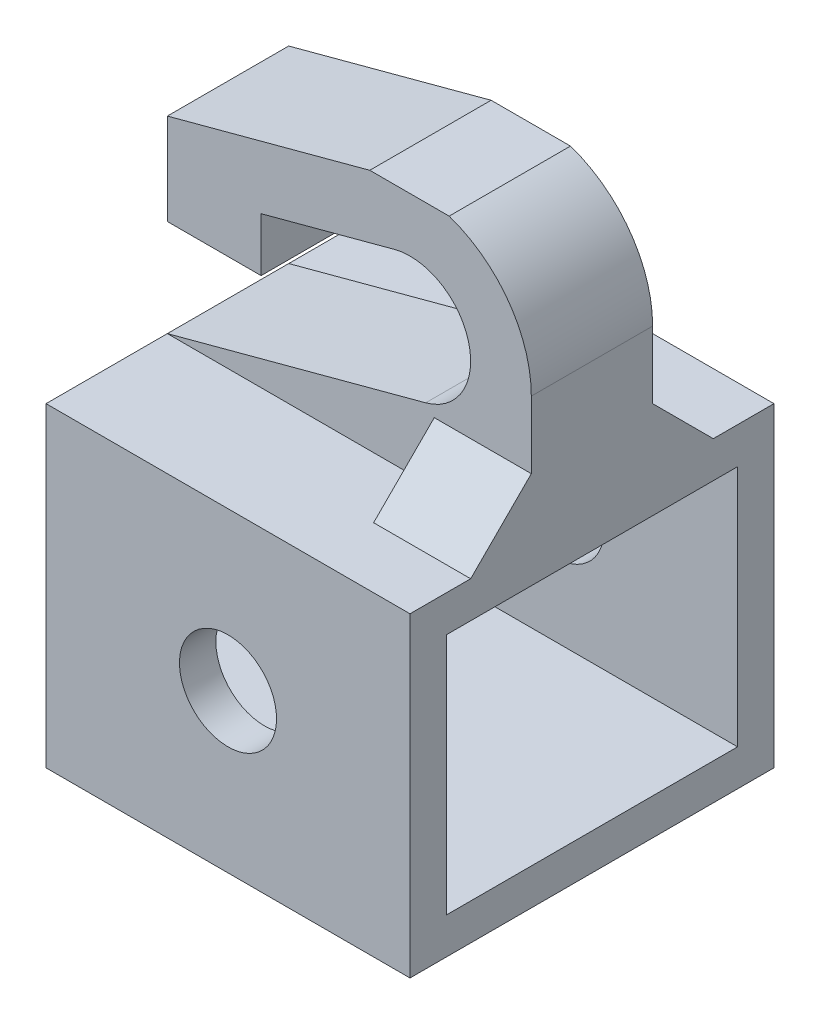
ISO-10303-21;
HEADER;
FILE_DESCRIPTION(('STEP AP214'),'2;1');
FILE_NAME('part.step','',(''),(''),'','','');
FILE_SCHEMA(('AUTOMOTIVE_DESIGN { 1 0 10303 214 1 1 1 1 }'));
ENDSEC;
DATA;
#1=APPLICATION_CONTEXT('core data for automotive mechanical design processes');
#2=APPLICATION_PROTOCOL_DEFINITION('international standard','automotive_design',2000,#1);
#3=PRODUCT_CONTEXT('',#1,'mechanical');
#4=PRODUCT('Part','Part','',(#3));
#5=PRODUCT_RELATED_PRODUCT_CATEGORY('part','',(#4));
#6=PRODUCT_DEFINITION_FORMATION('','',#4);
#7=PRODUCT_DEFINITION_CONTEXT('part definition',#1,'design');
#8=PRODUCT_DEFINITION('design','',#6,#7);
#9=PRODUCT_DEFINITION_SHAPE('','',#8);
#10=(LENGTH_UNIT() NAMED_UNIT(*) SI_UNIT(.MILLI.,.METRE.));
#11=(NAMED_UNIT(*) PLANE_ANGLE_UNIT() SI_UNIT($,.RADIAN.));
#12=(NAMED_UNIT(*) SI_UNIT($,.STERADIAN.) SOLID_ANGLE_UNIT());
#13=UNCERTAINTY_MEASURE_WITH_UNIT(LENGTH_MEASURE(1.E-05),#10,'distance_accuracy_value','');
#14=(GEOMETRIC_REPRESENTATION_CONTEXT(3) GLOBAL_UNCERTAINTY_ASSIGNED_CONTEXT((#13)) GLOBAL_UNIT_ASSIGNED_CONTEXT((#10,
#11,#12)) REPRESENTATION_CONTEXT('',''));
#15=CARTESIAN_POINT('',(0.,0.,0.));
#16=DIRECTION('',(0.,0.,1.));
#17=DIRECTION('',(1.,0.,0.));
#18=AXIS2_PLACEMENT_3D('',#15,#16,#17);
#19=CARTESIAN_POINT('',(-15.,36.3527618041008,5.00000000000001));
#20=DIRECTION('',(-0.258819045102522,0.965925826289068,0.));
#21=DIRECTION('',(-0.965925826289068,-0.258819045102522,0.));
#22=AXIS2_PLACEMENT_3D('',#19,#20,#21);
#23=PLANE('',#22);
#24=DIRECTION('',(0.,0.,1.));
#25=VECTOR('',#24,1.);
#26=CARTESIAN_POINT('',(-7.27259338968745,38.423314164921,-4.99999999999999));
#27=LINE('',#26,#25);
#28=CARTESIAN_POINT('',(-7.27259338968746,38.423314164921,-4.99999999999999));
#29=VERTEX_POINT('',#28);
#30=CARTESIAN_POINT('',(-7.27259338968746,38.423314164921,5.00000000000001));
#31=VERTEX_POINT('',#30);
#32=EDGE_CURVE('E54',#29,#31,#27,.T.);
#33=ORIENTED_EDGE('',*,*,#32,.F.);
#34=DIRECTION('',(0.965925826289068,0.258819045102522,0.));
#35=VECTOR('',#34,1.);
#36=CARTESIAN_POINT('',(-15.,36.3527618041008,-4.99999999999999));
#37=LINE('',#36,#35);
#38=CARTESIAN_POINT('',(3.70590548389106,41.3649940722024,-4.99999999999999));
#39=VERTEX_POINT('',#38);
#40=EDGE_CURVE('E277',#29,#39,#37,.T.);
#41=ORIENTED_EDGE('',*,*,#40,.T.);
#42=DIRECTION('',(0.,0.,-1.));
#43=VECTOR('',#42,1.);
#44=CARTESIAN_POINT('',(3.70590548389106,41.3649940722024,5.00000000000001));
#45=LINE('',#44,#43);
#46=CARTESIAN_POINT('',(3.70590548389105,41.3649940722024,5.00000000000001));
#47=VERTEX_POINT('',#46);
#48=EDGE_CURVE('E284',#47,#39,#45,.T.);
#49=ORIENTED_EDGE('',*,*,#48,.F.);
#50=DIRECTION('',(0.965925826289068,0.258819045102522,0.));
#51=VECTOR('',#50,1.);
#52=CARTESIAN_POINT('',(-15.,36.3527618041008,5.00000000000001));
#53=LINE('',#52,#51);
#54=EDGE_CURVE('E49',#31,#47,#53,.T.);
#55=ORIENTED_EDGE('',*,*,#54,.F.);
#56=EDGE_LOOP('',(#33,#41,#49,#55));
#57=FACE_BOUND('',#56,.T.);
#58=ADVANCED_FACE('F33',(#57),#23,.F.);
#59=CARTESIAN_POINT('',(-15.,26.,15.));
#60=DIRECTION('',(1.,0.,0.));
#61=DIRECTION('',(0.,0.,-1.));
#62=AXIS2_PLACEMENT_3D('',#59,#60,#61);
#63=PLANE('',#62);
#64=DIRECTION('',(0.,0.,1.));
#65=VECTOR('',#64,1.);
#66=CARTESIAN_POINT('',(-15.,3.,0.));
#67=LINE('',#66,#65);
#68=CARTESIAN_POINT('',(-15.,3.,-12.));
#69=VERTEX_POINT('',#68);
#70=CARTESIAN_POINT('',(-15.,3.,12.));
#71=VERTEX_POINT('',#70);
#72=EDGE_CURVE('E315',#69,#71,#67,.T.);
#73=ORIENTED_EDGE('',*,*,#72,.F.);
#74=DIRECTION('',(0.,-1.,0.));
#75=VECTOR('',#74,1.);
#76=CARTESIAN_POINT('',(-15.,26.,-12.));
#77=LINE('',#76,#75);
#78=CARTESIAN_POINT('',(-15.,23.,-12.));
#79=VERTEX_POINT('',#78);
#80=EDGE_CURVE('E325',#79,#69,#77,.T.);
#81=ORIENTED_EDGE('',*,*,#80,.F.);
#82=DIRECTION('',(0.,0.,1.));
#83=VECTOR('',#82,1.);
#84=CARTESIAN_POINT('',(-15.,23.,0.));
#85=LINE('',#84,#83);
#86=CARTESIAN_POINT('',(-15.,23.,12.));
#87=VERTEX_POINT('',#86);
#88=EDGE_CURVE('E318',#79,#87,#85,.T.);
#89=ORIENTED_EDGE('',*,*,#88,.T.);
#90=DIRECTION('',(0.,-1.,0.));
#91=VECTOR('',#90,1.);
#92=CARTESIAN_POINT('',(-15.,26.,12.));
#93=LINE('',#92,#91);
#94=EDGE_CURVE('E329',#87,#71,#93,.T.);
#95=ORIENTED_EDGE('',*,*,#94,.T.);
#96=EDGE_LOOP('',(#73,#81,#89,#95));
#97=FACE_BOUND('',#96,.T.);
#98=DIRECTION('',(0.,0.,1.));
#99=VECTOR('',#98,1.);
#100=CARTESIAN_POINT('',(-15.,26.,15.));
#101=LINE('',#100,#99);
#102=CARTESIAN_POINT('',(-15.,26.,5.00000000000001));
#103=VERTEX_POINT('',#102);
#104=CARTESIAN_POINT('',(-15.,26.,15.));
#105=VERTEX_POINT('',#104);
#106=EDGE_CURVE('E349',#103,#105,#101,.T.);
#107=ORIENTED_EDGE('',*,*,#106,.F.);
#108=DIRECTION('',(0.,0.,-1.));
#109=VECTOR('',#108,1.);
#110=CARTESIAN_POINT('',(-15.,26.,5.00000000000001));
#111=LINE('',#110,#109);
#112=CARTESIAN_POINT('',(-15.,26.,-4.99999999999999));
#113=VERTEX_POINT('',#112);
#114=EDGE_CURVE('E274',#103,#113,#111,.T.);
#115=ORIENTED_EDGE('',*,*,#114,.T.);
#116=CARTESIAN_POINT('',(-15.,26.,-15.));
#117=VERTEX_POINT('',#116);
#118=EDGE_CURVE('E350',#117,#113,#101,.T.);
#119=ORIENTED_EDGE('',*,*,#118,.F.);
#120=DIRECTION('',(0.,-1.,0.));
#121=VECTOR('',#120,1.);
#122=CARTESIAN_POINT('',(-15.,26.,-15.));
#123=LINE('',#122,#121);
#124=CARTESIAN_POINT('',(-15.,0.,-15.));
#125=VERTEX_POINT('',#124);
#126=EDGE_CURVE('E42',#117,#125,#123,.T.);
#127=ORIENTED_EDGE('',*,*,#126,.T.);
#128=DIRECTION('',(0.,0.,1.));
#129=VECTOR('',#128,1.);
#130=CARTESIAN_POINT('',(-15.,0.,15.));
#131=LINE('',#130,#129);
#132=CARTESIAN_POINT('',(-15.,0.,15.));
#133=VERTEX_POINT('',#132);
#134=EDGE_CURVE('E360',#125,#133,#131,.T.);
#135=ORIENTED_EDGE('',*,*,#134,.T.);
#136=DIRECTION('',(0.,-1.,0.));
#137=VECTOR('',#136,1.);
#138=CARTESIAN_POINT('',(-15.,26.,15.));
#139=LINE('',#138,#137);
#140=EDGE_CURVE('E366',#105,#133,#139,.T.);
#141=ORIENTED_EDGE('',*,*,#140,.F.);
#142=EDGE_LOOP('',(#107,#115,#119,#127,#135,#141));
#143=FACE_BOUND('',#142,.T.);
#144=ADVANCED_FACE('F375',(#97,#143),#63,.F.);
#145=CARTESIAN_POINT('',(0.,26.,0.));
#146=DIRECTION('',(0.,-1.,0.));
#147=DIRECTION('',(0.,0.,-1.));
#148=AXIS2_PLACEMENT_3D('',#145,#146,#147);
#149=PLANE('',#148);
#150=DIRECTION('',(-1.,0.,0.));
#151=VECTOR('',#150,1.);
#152=CARTESIAN_POINT('',(-15.,26.,-15.));
#153=LINE('',#152,#151);
#154=CARTESIAN_POINT('',(15.,26.,-15.));
#155=VERTEX_POINT('',#154);
#156=EDGE_CURVE('E346',#155,#117,#153,.T.);
#157=ORIENTED_EDGE('',*,*,#156,.T.);
#158=ORIENTED_EDGE('',*,*,#118,.T.);
#159=DIRECTION('',(-1.,0.,0.));
#160=VECTOR('',#159,1.);
#161=CARTESIAN_POINT('',(37.3606797749979,26.,-4.99999999999999));
#162=LINE('',#161,#160);
#163=CARTESIAN_POINT('',(7.,26.,-4.99999999999999));
#164=VERTEX_POINT('',#163);
#165=EDGE_CURVE('E301',#164,#113,#162,.T.);
#166=ORIENTED_EDGE('',*,*,#165,.F.);
#167=DIRECTION('',(0.,0.,1.));
#168=VECTOR('',#167,1.);
#169=CARTESIAN_POINT('',(7.,26.,0.));
#170=LINE('',#169,#168);
#171=CARTESIAN_POINT('',(7.,26.,-9.99999999999999));
#172=VERTEX_POINT('',#171);
#173=EDGE_CURVE('E259',#172,#164,#170,.T.);
#174=ORIENTED_EDGE('',*,*,#173,.F.);
#175=DIRECTION('',(-1.,0.,0.));
#176=VECTOR('',#175,1.);
#177=CARTESIAN_POINT('',(0.,26.,-9.99999999999999));
#178=LINE('',#177,#176);
#179=CARTESIAN_POINT('',(15.,26.,-9.99999999999999));
#180=VERTEX_POINT('',#179);
#181=EDGE_CURVE('E264',#172,#180,#178,.F.);
#182=ORIENTED_EDGE('',*,*,#181,.T.);
#183=DIRECTION('',(0.,0.,-1.));
#184=VECTOR('',#183,1.);
#185=CARTESIAN_POINT('',(15.,26.,15.));
#186=LINE('',#185,#184);
#187=EDGE_CURVE('E347',#180,#155,#186,.T.);
#188=ORIENTED_EDGE('',*,*,#187,.T.);
#189=EDGE_LOOP('',(#157,#158,#166,#174,#182,#188));
#190=FACE_BOUND('',#189,.T.);
#191=ADVANCED_FACE('F408',(#190),#149,.F.);
#192=CARTESIAN_POINT('',(15.,26.,15.));
#193=DIRECTION('',(-1.,0.,0.));
#194=DIRECTION('',(0.,0.,1.));
#195=AXIS2_PLACEMENT_3D('',#192,#193,#194);
#196=PLANE('',#195);
#197=DIRECTION('',(0.,-1.,0.));
#198=VECTOR('',#197,1.);
#199=CARTESIAN_POINT('',(15.,26.,-4.99999999999999));
#200=LINE('',#199,#198);
#201=CARTESIAN_POINT('',(15.,36.5353647506729,-4.99999999999999));
#202=VERTEX_POINT('',#201);
#203=CARTESIAN_POINT('',(15.,31.,-4.99999999999999));
#204=VERTEX_POINT('',#203);
#205=EDGE_CURVE('E292',#202,#204,#200,.T.);
#206=ORIENTED_EDGE('',*,*,#205,.F.);
#207=DIRECTION('',(0.,0.,-1.));
#208=VECTOR('',#207,1.);
#209=CARTESIAN_POINT('',(15.,36.5353647506729,5.00000000000001));
#210=LINE('',#209,#208);
#211=CARTESIAN_POINT('',(15.,36.5353647506729,5.00000000000001));
#212=VERTEX_POINT('',#211);
#213=EDGE_CURVE('E220',#212,#202,#210,.T.);
#214=ORIENTED_EDGE('',*,*,#213,.F.);
#215=DIRECTION('',(0.,1.,0.));
#216=VECTOR('',#215,1.);
#217=CARTESIAN_POINT('',(15.,46.,5.00000000000001));
#218=LINE('',#217,#216);
#219=CARTESIAN_POINT('',(15.,31.,5.00000000000001));
#220=VERTEX_POINT('',#219);
#221=EDGE_CURVE('E294',#220,#212,#218,.T.);
#222=ORIENTED_EDGE('',*,*,#221,.F.);
#223=DIRECTION('',(0.,-0.707106781186547,0.707106781186548));
#224=VECTOR('',#223,1.);
#225=CARTESIAN_POINT('',(15.,31.,4.99999999999999));
#226=LINE('',#225,#224);
#227=CARTESIAN_POINT('',(15.,26.,9.99999999999999));
#228=VERTEX_POINT('',#227);
#229=EDGE_CURVE('E235',#220,#228,#226,.T.);
#230=ORIENTED_EDGE('',*,*,#229,.T.);
#231=CARTESIAN_POINT('',(15.,26.,15.));
#232=VERTEX_POINT('',#231);
#233=EDGE_CURVE('E344',#232,#228,#186,.T.);
#234=ORIENTED_EDGE('',*,*,#233,.F.);
#235=DIRECTION('',(0.,-1.,0.));
#236=VECTOR('',#235,1.);
#237=CARTESIAN_POINT('',(15.,26.,15.));
#238=LINE('',#237,#236);
#239=CARTESIAN_POINT('',(15.,0.,15.));
#240=VERTEX_POINT('',#239);
#241=EDGE_CURVE('E355',#232,#240,#238,.T.);
#242=ORIENTED_EDGE('',*,*,#241,.T.);
#243=DIRECTION('',(0.,0.,-1.));
#244=VECTOR('',#243,1.);
#245=CARTESIAN_POINT('',(15.,0.,15.));
#246=LINE('',#245,#244);
#247=CARTESIAN_POINT('',(15.,0.,-15.));
#248=VERTEX_POINT('',#247);
#249=EDGE_CURVE('E337',#240,#248,#246,.T.);
#250=ORIENTED_EDGE('',*,*,#249,.T.);
#251=DIRECTION('',(0.,-1.,0.));
#252=VECTOR('',#251,1.);
#253=CARTESIAN_POINT('',(15.,26.,-15.));
#254=LINE('',#253,#252);
#255=EDGE_CURVE('E11',#155,#248,#254,.T.);
#256=ORIENTED_EDGE('',*,*,#255,.F.);
#257=ORIENTED_EDGE('',*,*,#187,.F.);
#258=DIRECTION('',(0.,-0.707106781186547,-0.707106781186548));
#259=VECTOR('',#258,1.);
#260=CARTESIAN_POINT('',(15.,31.,-4.99999999999999));
#261=LINE('',#260,#259);
#262=EDGE_CURVE('E251',#204,#180,#261,.T.);
#263=ORIENTED_EDGE('',*,*,#262,.F.);
#264=EDGE_LOOP('',(#206,#214,#222,#230,#234,#242,#250,#256,#257,#263));
#265=FACE_BOUND('',#264,.T.);
#266=DIRECTION('',(0.,0.,-1.));
#267=VECTOR('',#266,1.);
#268=CARTESIAN_POINT('',(15.,3.,0.));
#269=LINE('',#268,#267);
#270=CARTESIAN_POINT('',(15.,3.,12.));
#271=VERTEX_POINT('',#270);
#272=CARTESIAN_POINT('',(15.,3.,-12.));
#273=VERTEX_POINT('',#272);
#274=EDGE_CURVE('E312',#271,#273,#269,.T.);
#275=ORIENTED_EDGE('',*,*,#274,.F.);
#276=DIRECTION('',(0.,-1.,0.));
#277=VECTOR('',#276,1.);
#278=CARTESIAN_POINT('',(15.,26.,12.));
#279=LINE('',#278,#277);
#280=CARTESIAN_POINT('',(15.,23.,12.));
#281=VERTEX_POINT('',#280);
#282=EDGE_CURVE('E322',#281,#271,#279,.T.);
#283=ORIENTED_EDGE('',*,*,#282,.F.);
#284=DIRECTION('',(0.,0.,-1.));
#285=VECTOR('',#284,1.);
#286=CARTESIAN_POINT('',(15.,23.,0.));
#287=LINE('',#286,#285);
#288=CARTESIAN_POINT('',(15.,23.,-12.));
#289=VERTEX_POINT('',#288);
#290=EDGE_CURVE('E319',#281,#289,#287,.T.);
#291=ORIENTED_EDGE('',*,*,#290,.T.);
#292=DIRECTION('',(0.,-1.,0.));
#293=VECTOR('',#292,1.);
#294=CARTESIAN_POINT('',(15.,26.,-12.));
#295=LINE('',#294,#293);
#296=EDGE_CURVE('E328',#289,#273,#295,.T.);
#297=ORIENTED_EDGE('',*,*,#296,.T.);
#298=EDGE_LOOP('',(#275,#283,#291,#297));
#299=FACE_BOUND('',#298,.T.);
#300=ADVANCED_FACE('F35',(#265,#299),#196,.F.);
#301=DIRECTION('',(0.,1.,0.));
#302=VECTOR('',#301,1.);
#303=CARTESIAN_POINT('',(-15.,46.,5.00000000000001));
#304=LINE('',#303,#302);
#305=CARTESIAN_POINT('',(-15.,34.,5.00000000000001));
#306=VERTEX_POINT('',#305);
#307=CARTESIAN_POINT('',(-15.,41.5291427061512,5.00000000000001));
#308=VERTEX_POINT('',#307);
#309=EDGE_CURVE('E209',#306,#308,#304,.T.);
#310=ORIENTED_EDGE('',*,*,#309,.T.);
#311=DIRECTION('',(0.,0.,-1.));
#312=VECTOR('',#311,1.);
#313=CARTESIAN_POINT('',(-15.,41.5291427061512,5.00000000000001));
#314=LINE('',#313,#312);
#315=CARTESIAN_POINT('',(-15.,41.5291427061512,-4.99999999999999));
#316=VERTEX_POINT('',#315);
#317=EDGE_CURVE('E229',#308,#316,#314,.T.);
#318=ORIENTED_EDGE('',*,*,#317,.T.);
#319=DIRECTION('',(0.,-1.,0.));
#320=VECTOR('',#319,1.);
#321=CARTESIAN_POINT('',(-15.,26.,-4.99999999999999));
#322=LINE('',#321,#320);
#323=CARTESIAN_POINT('',(-15.,34.,-4.99999999999999));
#324=VERTEX_POINT('',#323);
#325=EDGE_CURVE('E283',#316,#324,#322,.T.);
#326=ORIENTED_EDGE('',*,*,#325,.T.);
#327=DIRECTION('',(0.,0.,1.));
#328=VECTOR('',#327,1.);
#329=CARTESIAN_POINT('',(-15.,34.,5.00000000000001));
#330=LINE('',#329,#328);
#331=EDGE_CURVE('E219',#324,#306,#330,.T.);
#332=ORIENTED_EDGE('',*,*,#331,.T.);
#333=EDGE_LOOP('',(#310,#318,#326,#332));
#334=FACE_BOUND('',#333,.T.);
#335=ADVANCED_FACE('F425',(#334),#63,.F.);
#336=CARTESIAN_POINT('',(-15.,26.,-15.));
#337=DIRECTION('',(0.,0.,1.));
#338=DIRECTION('',(1.,0.,0.));
#339=AXIS2_PLACEMENT_3D('',#336,#337,#338);
#340=PLANE('',#339);
#341=DIRECTION('',(-1.,0.,0.));
#342=VECTOR('',#341,1.);
#343=CARTESIAN_POINT('',(-15.,0.,-15.));
#344=LINE('',#343,#342);
#345=EDGE_CURVE('E358',#248,#125,#344,.T.);
#346=ORIENTED_EDGE('',*,*,#345,.T.);
#347=ORIENTED_EDGE('',*,*,#126,.F.);
#348=ORIENTED_EDGE('',*,*,#156,.F.);
#349=ORIENTED_EDGE('',*,*,#255,.T.);
#350=EDGE_LOOP('',(#346,#347,#348,#349));
#351=FACE_BOUND('',#350,.T.);
#352=CARTESIAN_POINT('',(0.,13.,-15.));
#353=DIRECTION('',(0.,0.,1.));
#354=DIRECTION('',(1.,0.,0.));
#355=AXIS2_PLACEMENT_3D('',#352,#353,#354);
#356=CIRCLE('',#355,4.);
#357=CARTESIAN_POINT('',(4.,13.,-15.));
#358=VERTEX_POINT('',#357);
#359=EDGE_CURVE('E304',#358,#358,#356,.T.);
#360=ORIENTED_EDGE('',*,*,#359,.T.);
#361=EDGE_LOOP('',(#360));
#362=FACE_BOUND('',#361,.T.);
#363=ADVANCED_FACE('F422',(#351,#362),#340,.F.);
#364=CARTESIAN_POINT('',(-15.,26.,15.));
#365=DIRECTION('',(0.,0.,-1.));
#366=DIRECTION('',(-1.,0.,0.));
#367=AXIS2_PLACEMENT_3D('',#364,#365,#366);
#368=PLANE('',#367);
#369=DIRECTION('',(1.,0.,0.));
#370=VECTOR('',#369,1.);
#371=CARTESIAN_POINT('',(-15.,0.,15.));
#372=LINE('',#371,#370);
#373=EDGE_CURVE('E362',#133,#240,#372,.T.);
#374=ORIENTED_EDGE('',*,*,#373,.T.);
#375=ORIENTED_EDGE('',*,*,#241,.F.);
#376=DIRECTION('',(1.,0.,0.));
#377=VECTOR('',#376,1.);
#378=CARTESIAN_POINT('',(-15.,26.,15.));
#379=LINE('',#378,#377);
#380=EDGE_CURVE('E353',#105,#232,#379,.T.);
#381=ORIENTED_EDGE('',*,*,#380,.F.);
#382=ORIENTED_EDGE('',*,*,#140,.T.);
#383=EDGE_LOOP('',(#374,#375,#381,#382));
#384=FACE_BOUND('',#383,.T.);
#385=CARTESIAN_POINT('',(0.,13.,15.));
#386=DIRECTION('',(0.,0.,1.));
#387=DIRECTION('',(1.,0.,0.));
#388=AXIS2_PLACEMENT_3D('',#385,#386,#387);
#389=CIRCLE('',#388,4.);
#390=CARTESIAN_POINT('',(4.,13.,15.));
#391=VERTEX_POINT('',#390);
#392=EDGE_CURVE('E297',#391,#391,#389,.T.);
#393=ORIENTED_EDGE('',*,*,#392,.F.);
#394=EDGE_LOOP('',(#393));
#395=FACE_BOUND('',#394,.T.);
#396=ADVANCED_FACE('F386',(#384,#395),#368,.F.);
#397=ORIENTED_EDGE('',*,*,#233,.T.);
#398=DIRECTION('',(-1.,0.,0.));
#399=VECTOR('',#398,1.);
#400=CARTESIAN_POINT('',(0.,26.,9.99999999999999));
#401=LINE('',#400,#399);
#402=CARTESIAN_POINT('',(7.,26.,9.99999999999999));
#403=VERTEX_POINT('',#402);
#404=EDGE_CURVE('E248',#228,#403,#401,.T.);
#405=ORIENTED_EDGE('',*,*,#404,.T.);
#406=DIRECTION('',(0.,0.,1.));
#407=VECTOR('',#406,1.);
#408=CARTESIAN_POINT('',(7.,26.,0.));
#409=LINE('',#408,#407);
#410=CARTESIAN_POINT('',(7.,26.,5.00000000000001));
#411=VERTEX_POINT('',#410);
#412=EDGE_CURVE('E243',#411,#403,#409,.T.);
#413=ORIENTED_EDGE('',*,*,#412,.F.);
#414=DIRECTION('',(-1.,0.,0.));
#415=VECTOR('',#414,1.);
#416=CARTESIAN_POINT('',(37.3606797749979,26.,5.00000000000001));
#417=LINE('',#416,#415);
#418=EDGE_CURVE('E295',#411,#103,#417,.T.);
#419=ORIENTED_EDGE('',*,*,#418,.T.);
#420=ORIENTED_EDGE('',*,*,#106,.T.);
#421=ORIENTED_EDGE('',*,*,#380,.T.);
#422=EDGE_LOOP('',(#397,#405,#413,#419,#420,#421));
#423=FACE_BOUND('',#422,.T.);
#424=ADVANCED_FACE('F392',(#423),#149,.F.);
#425=CARTESIAN_POINT('',(0.,0.,0.));
#426=DIRECTION('',(0.,-1.,0.));
#427=DIRECTION('',(0.,0.,-1.));
#428=AXIS2_PLACEMENT_3D('',#425,#426,#427);
#429=PLANE('',#428);
#430=ORIENTED_EDGE('',*,*,#249,.F.);
#431=ORIENTED_EDGE('',*,*,#373,.F.);
#432=ORIENTED_EDGE('',*,*,#134,.F.);
#433=ORIENTED_EDGE('',*,*,#345,.F.);
#434=EDGE_LOOP('',(#430,#431,#432,#433));
#435=FACE_BOUND('',#434,.T.);
#436=ADVANCED_FACE('F383',(#435),#429,.T.);
#437=CARTESIAN_POINT('',(-15.,26.,-12.));
#438=DIRECTION('',(0.,0.,1.));
#439=DIRECTION('',(1.,0.,0.));
#440=AXIS2_PLACEMENT_3D('',#437,#438,#439);
#441=PLANE('',#440);
#442=DIRECTION('',(-1.,0.,0.));
#443=VECTOR('',#442,1.);
#444=CARTESIAN_POINT('',(0.,23.,-12.));
#445=LINE('',#444,#443);
#446=EDGE_CURVE('E316',#289,#79,#445,.T.);
#447=ORIENTED_EDGE('',*,*,#446,.T.);
#448=ORIENTED_EDGE('',*,*,#80,.T.);
#449=DIRECTION('',(-1.,0.,0.));
#450=VECTOR('',#449,1.);
#451=CARTESIAN_POINT('',(0.,3.,-12.));
#452=LINE('',#451,#450);
#453=EDGE_CURVE('E313',#273,#69,#452,.T.);
#454=ORIENTED_EDGE('',*,*,#453,.F.);
#455=ORIENTED_EDGE('',*,*,#296,.F.);
#456=EDGE_LOOP('',(#447,#448,#454,#455));
#457=FACE_BOUND('',#456,.T.);
#458=CARTESIAN_POINT('',(0.,13.,-12.));
#459=DIRECTION('',(0.,0.,1.));
#460=DIRECTION('',(1.,0.,0.));
#461=AXIS2_PLACEMENT_3D('',#458,#459,#460);
#462=CIRCLE('',#461,4.);
#463=CARTESIAN_POINT('',(4.,13.,-12.));
#464=VERTEX_POINT('',#463);
#465=EDGE_CURVE('E309',#464,#464,#462,.T.);
#466=ORIENTED_EDGE('',*,*,#465,.F.);
#467=EDGE_LOOP('',(#466));
#468=FACE_BOUND('',#467,.T.);
#469=ADVANCED_FACE('F615',(#457,#468),#441,.T.);
#470=CARTESIAN_POINT('',(-15.,26.,12.));
#471=DIRECTION('',(0.,0.,-1.));
#472=DIRECTION('',(-1.,0.,0.));
#473=AXIS2_PLACEMENT_3D('',#470,#471,#472);
#474=PLANE('',#473);
#475=ORIENTED_EDGE('',*,*,#282,.T.);
#476=DIRECTION('',(1.,0.,0.));
#477=VECTOR('',#476,1.);
#478=CARTESIAN_POINT('',(0.,3.,12.));
#479=LINE('',#478,#477);
#480=EDGE_CURVE('E323',#71,#271,#479,.T.);
#481=ORIENTED_EDGE('',*,*,#480,.F.);
#482=ORIENTED_EDGE('',*,*,#94,.F.);
#483=DIRECTION('',(1.,0.,0.));
#484=VECTOR('',#483,1.);
#485=CARTESIAN_POINT('',(0.,23.,12.));
#486=LINE('',#485,#484);
#487=EDGE_CURVE('E320',#87,#281,#486,.T.);
#488=ORIENTED_EDGE('',*,*,#487,.T.);
#489=EDGE_LOOP('',(#475,#481,#482,#488));
#490=FACE_BOUND('',#489,.T.);
#491=CARTESIAN_POINT('',(0.,13.,12.));
#492=DIRECTION('',(0.,0.,-1.));
#493=DIRECTION('',(-1.,0.,0.));
#494=AXIS2_PLACEMENT_3D('',#491,#492,#493);
#495=CIRCLE('',#494,4.);
#496=CARTESIAN_POINT('',(-4.,13.,12.));
#497=VERTEX_POINT('',#496);
#498=EDGE_CURVE('E37',#497,#497,#495,.T.);
#499=ORIENTED_EDGE('',*,*,#498,.F.);
#500=EDGE_LOOP('',(#499));
#501=FACE_BOUND('',#500,.T.);
#502=ADVANCED_FACE('F622',(#490,#501),#474,.T.);
#503=CARTESIAN_POINT('',(0.,23.,0.));
#504=DIRECTION('',(0.,-1.,0.));
#505=DIRECTION('',(0.,0.,-1.));
#506=AXIS2_PLACEMENT_3D('',#503,#504,#505);
#507=PLANE('',#506);
#508=ORIENTED_EDGE('',*,*,#290,.F.);
#509=ORIENTED_EDGE('',*,*,#487,.F.);
#510=ORIENTED_EDGE('',*,*,#88,.F.);
#511=ORIENTED_EDGE('',*,*,#446,.F.);
#512=EDGE_LOOP('',(#508,#509,#510,#511));
#513=FACE_BOUND('',#512,.T.);
#514=ADVANCED_FACE('F629',(#513),#507,.T.);
#515=CARTESIAN_POINT('',(0.,3.,0.));
#516=DIRECTION('',(0.,-1.,0.));
#517=DIRECTION('',(0.,0.,-1.));
#518=AXIS2_PLACEMENT_3D('',#515,#516,#517);
#519=PLANE('',#518);
#520=ORIENTED_EDGE('',*,*,#453,.T.);
#521=ORIENTED_EDGE('',*,*,#72,.T.);
#522=ORIENTED_EDGE('',*,*,#480,.T.);
#523=ORIENTED_EDGE('',*,*,#274,.T.);
#524=EDGE_LOOP('',(#520,#521,#522,#523));
#525=FACE_BOUND('',#524,.T.);
#526=ADVANCED_FACE('F440',(#525),#519,.F.);
#527=CARTESIAN_POINT('',(0.,13.,-15.));
#528=DIRECTION('',(0.,0.,1.));
#529=DIRECTION('',(1.,0.,0.));
#530=AXIS2_PLACEMENT_3D('',#527,#528,#529);
#531=CYLINDRICAL_SURFACE('',#530,4.);
#532=ORIENTED_EDGE('',*,*,#498,.T.);
#533=EDGE_LOOP('',(#532));
#534=FACE_BOUND('',#533,.T.);
#535=ORIENTED_EDGE('',*,*,#392,.T.);
#536=EDGE_LOOP('',(#535));
#537=FACE_BOUND('',#536,.T.);
#538=ADVANCED_FACE('F431',(#534,#537),#531,.F.);
#539=ORIENTED_EDGE('',*,*,#465,.T.);
#540=EDGE_LOOP('',(#539));
#541=FACE_BOUND('',#540,.T.);
#542=ORIENTED_EDGE('',*,*,#359,.F.);
#543=EDGE_LOOP('',(#542));
#544=FACE_BOUND('',#543,.T.);
#545=ADVANCED_FACE('F428',(#541,#544),#531,.F.);
#546=CARTESIAN_POINT('',(37.3606797749979,46.,-4.99999999999999));
#547=DIRECTION('',(0.,-1.,0.));
#548=DIRECTION('',(0.,0.,-1.));
#549=AXIS2_PLACEMENT_3D('',#546,#547,#548);
#550=PLANE('',#549);
#551=DIRECTION('',(-1.,0.,0.));
#552=VECTOR('',#551,1.);
#553=CARTESIAN_POINT('',(37.3606797749979,46.,5.00000000000001));
#554=LINE('',#553,#552);
#555=CARTESIAN_POINT('',(8.22810774250111,46.,5.00000000000001));
#556=VERTEX_POINT('',#555);
#557=CARTESIAN_POINT('',(1.68546657403336,46.,5.00000000000001));
#558=VERTEX_POINT('',#557);
#559=EDGE_CURVE('E291',#556,#558,#554,.T.);
#560=ORIENTED_EDGE('',*,*,#559,.F.);
#561=DIRECTION('',(0.,0.,-1.));
#562=VECTOR('',#561,1.);
#563=CARTESIAN_POINT('',(8.2281077425011,46.,5.00000000000001));
#564=LINE('',#563,#562);
#565=CARTESIAN_POINT('',(8.2281077425011,46.,-4.99999999999999));
#566=VERTEX_POINT('',#565);
#567=EDGE_CURVE('E216',#556,#566,#564,.T.);
#568=ORIENTED_EDGE('',*,*,#567,.T.);
#569=DIRECTION('',(-1.,0.,0.));
#570=VECTOR('',#569,1.);
#571=CARTESIAN_POINT('',(37.3606797749979,46.,-4.99999999999999));
#572=LINE('',#571,#570);
#573=CARTESIAN_POINT('',(1.68546657403336,46.,-4.99999999999999));
#574=VERTEX_POINT('',#573);
#575=EDGE_CURVE('E299',#566,#574,#572,.T.);
#576=ORIENTED_EDGE('',*,*,#575,.T.);
#577=DIRECTION('',(0.,0.,-1.));
#578=VECTOR('',#577,1.);
#579=CARTESIAN_POINT('',(1.68546657403336,46.,5.00000000000001));
#580=LINE('',#579,#578);
#581=EDGE_CURVE('E227',#558,#574,#580,.T.);
#582=ORIENTED_EDGE('',*,*,#581,.F.);
#583=EDGE_LOOP('',(#560,#568,#576,#582));
#584=FACE_BOUND('',#583,.T.);
#585=ADVANCED_FACE('F430',(#584),#550,.F.);
#586=CARTESIAN_POINT('',(37.3606797749979,26.,-4.99999999999999));
#587=DIRECTION('',(0.,0.,1.));
#588=DIRECTION('',(1.,0.,0.));
#589=AXIS2_PLACEMENT_3D('',#586,#587,#588);
#590=PLANE('',#589);
#591=ORIENTED_EDGE('',*,*,#575,.F.);
#592=CARTESIAN_POINT('',(5.,36.5353647506729,-4.99999999999999));
#593=DIRECTION('',(0.,0.,1.));
#594=DIRECTION('',(-1.,0.,0.));
#595=AXIS2_PLACEMENT_3D('',#592,#593,#594);
#596=CIRCLE('',#595,10.);
#597=EDGE_CURVE('E217',#202,#566,#596,.T.);
#598=ORIENTED_EDGE('',*,*,#597,.F.);
#599=ORIENTED_EDGE('',*,*,#205,.T.);
#600=DIRECTION('',(1.,0.,0.));
#601=VECTOR('',#600,1.);
#602=CARTESIAN_POINT('',(37.3606797749979,31.,-4.99999999999999));
#603=LINE('',#602,#601);
#604=CARTESIAN_POINT('',(7.,31.,-4.99999999999999));
#605=VERTEX_POINT('',#604);
#606=EDGE_CURVE('E262',#204,#605,#603,.F.);
#607=ORIENTED_EDGE('',*,*,#606,.T.);
#608=DIRECTION('',(0.,1.,0.));
#609=VECTOR('',#608,1.);
#610=CARTESIAN_POINT('',(7.,26.,-4.99999999999999));
#611=LINE('',#610,#609);
#612=EDGE_CURVE('E254',#164,#605,#611,.T.);
#613=ORIENTED_EDGE('',*,*,#612,.F.);
#614=ORIENTED_EDGE('',*,*,#165,.T.);
#615=DIRECTION('',(-0.965925826289068,-0.258819045102521,0.));
#616=VECTOR('',#615,1.);
#617=CARTESIAN_POINT('',(6.29409522551262,31.7057356192275,-4.99999999999999));
#618=LINE('',#617,#616);
#619=CARTESIAN_POINT('',(6.29409522551262,31.7057356192276,-4.99999999999999));
#620=VERTEX_POINT('',#619);
#621=EDGE_CURVE('E266',#620,#113,#618,.T.);
#622=ORIENTED_EDGE('',*,*,#621,.F.);
#623=CARTESIAN_POINT('',(5.,36.5353647506729,-4.99999999999999));
#624=DIRECTION('',(0.,0.,-1.));
#625=DIRECTION('',(-1.,0.,0.));
#626=AXIS2_PLACEMENT_3D('',#623,#624,#625);
#627=CIRCLE('',#626,5.00000000000003);
#628=EDGE_CURVE('E270',#39,#620,#627,.T.);
#629=ORIENTED_EDGE('',*,*,#628,.F.);
#630=ORIENTED_EDGE('',*,*,#40,.F.);
#631=DIRECTION('',(0.,1.,0.));
#632=VECTOR('',#631,1.);
#633=CARTESIAN_POINT('',(-7.27259338968745,22.2290277055444,-4.99999999999999));
#634=LINE('',#633,#632);
#635=CARTESIAN_POINT('',(-7.27259338968745,34.,-4.99999999999999));
#636=VERTEX_POINT('',#635);
#637=EDGE_CURVE('E203',#636,#29,#634,.T.);
#638=ORIENTED_EDGE('',*,*,#637,.F.);
#639=DIRECTION('',(-1.,0.,0.));
#640=VECTOR('',#639,1.);
#641=CARTESIAN_POINT('',(-15.,34.,-4.99999999999999));
#642=LINE('',#641,#640);
#643=EDGE_CURVE('E195',#636,#324,#642,.T.);
#644=ORIENTED_EDGE('',*,*,#643,.T.);
#645=ORIENTED_EDGE('',*,*,#325,.F.);
#646=DIRECTION('',(-0.965925826289068,-0.258819045102522,0.));
#647=VECTOR('',#646,1.);
#648=CARTESIAN_POINT('',(-15.,41.5291427061512,-4.99999999999999));
#649=LINE('',#648,#647);
#650=EDGE_CURVE('E222',#574,#316,#649,.T.);
#651=ORIENTED_EDGE('',*,*,#650,.F.);
#652=EDGE_LOOP('',(#591,#598,#599,#607,#613,#614,#622,#629,#630,#638,#644,#645,#651));
#653=FACE_BOUND('',#652,.T.);
#654=ADVANCED_FACE('F405',(#653),#590,.F.);
#655=CARTESIAN_POINT('',(37.3606797749979,46.,5.00000000000001));
#656=DIRECTION('',(0.,0.,-1.));
#657=DIRECTION('',(0.,1.,0.));
#658=AXIS2_PLACEMENT_3D('',#655,#656,#657);
#659=PLANE('',#658);
#660=ORIENTED_EDGE('',*,*,#221,.T.);
#661=CARTESIAN_POINT('',(5.,36.5353647506729,5.00000000000001));
#662=DIRECTION('',(0.,0.,1.));
#663=DIRECTION('',(-1.,0.,0.));
#664=AXIS2_PLACEMENT_3D('',#661,#662,#663);
#665=CIRCLE('',#664,10.);
#666=EDGE_CURVE('E213',#212,#556,#665,.T.);
#667=ORIENTED_EDGE('',*,*,#666,.T.);
#668=ORIENTED_EDGE('',*,*,#559,.T.);
#669=DIRECTION('',(-0.965925826289068,-0.258819045102522,0.));
#670=VECTOR('',#669,1.);
#671=CARTESIAN_POINT('',(-15.,41.5291427061512,5.00000000000001));
#672=LINE('',#671,#670);
#673=EDGE_CURVE('E225',#558,#308,#672,.T.);
#674=ORIENTED_EDGE('',*,*,#673,.T.);
#675=ORIENTED_EDGE('',*,*,#309,.F.);
#676=DIRECTION('',(1.,0.,0.));
#677=VECTOR('',#676,1.);
#678=CARTESIAN_POINT('',(-7.27259338968745,34.,5.00000000000001));
#679=LINE('',#678,#677);
#680=CARTESIAN_POINT('',(-7.27259338968745,34.,5.00000000000001));
#681=VERTEX_POINT('',#680);
#682=EDGE_CURVE('E192',#306,#681,#679,.T.);
#683=ORIENTED_EDGE('',*,*,#682,.T.);
#684=DIRECTION('',(0.,1.,0.));
#685=VECTOR('',#684,1.);
#686=CARTESIAN_POINT('',(-7.27259338968745,22.2290277055444,5.00000000000001));
#687=LINE('',#686,#685);
#688=EDGE_CURVE('E200',#681,#31,#687,.T.);
#689=ORIENTED_EDGE('',*,*,#688,.T.);
#690=ORIENTED_EDGE('',*,*,#54,.T.);
#691=CARTESIAN_POINT('',(5.,36.5353647506729,5.00000000000001));
#692=DIRECTION('',(0.,0.,-1.));
#693=DIRECTION('',(-1.,0.,0.));
#694=AXIS2_PLACEMENT_3D('',#691,#692,#693);
#695=CIRCLE('',#694,5.00000000000003);
#696=CARTESIAN_POINT('',(6.29409522551262,31.7057356192276,5.00000000000001));
#697=VERTEX_POINT('',#696);
#698=EDGE_CURVE('E272',#47,#697,#695,.T.);
#699=ORIENTED_EDGE('',*,*,#698,.T.);
#700=DIRECTION('',(-0.965925826289068,-0.258819045102521,0.));
#701=VECTOR('',#700,1.);
#702=CARTESIAN_POINT('',(6.29409522551262,31.7057356192275,5.00000000000001));
#703=LINE('',#702,#701);
#704=EDGE_CURVE('E267',#697,#103,#703,.T.);
#705=ORIENTED_EDGE('',*,*,#704,.T.);
#706=ORIENTED_EDGE('',*,*,#418,.F.);
#707=DIRECTION('',(0.,-1.,0.));
#708=VECTOR('',#707,1.);
#709=CARTESIAN_POINT('',(7.,46.,5.00000000000001));
#710=LINE('',#709,#708);
#711=CARTESIAN_POINT('',(7.,31.,5.00000000000001));
#712=VERTEX_POINT('',#711);
#713=EDGE_CURVE('E238',#712,#411,#710,.T.);
#714=ORIENTED_EDGE('',*,*,#713,.F.);
#715=DIRECTION('',(1.,0.,0.));
#716=VECTOR('',#715,1.);
#717=CARTESIAN_POINT('',(37.3606797749979,31.,5.00000000000001));
#718=LINE('',#717,#716);
#719=EDGE_CURVE('E246',#712,#220,#718,.T.);
#720=ORIENTED_EDGE('',*,*,#719,.T.);
#721=EDGE_LOOP('',(#660,#667,#668,#674,#675,#683,#689,#690,#699,#705,#706,#714,#720));
#722=FACE_BOUND('',#721,.T.);
#723=ADVANCED_FACE('F206',(#722),#659,.F.);
#724=CARTESIAN_POINT('',(6.29409522551262,31.7057356192275,5.00000000000001));
#725=DIRECTION('',(0.258819045102521,-0.965925826289068,0.));
#726=DIRECTION('',(0.965925826289068,0.258819045102521,0.));
#727=AXIS2_PLACEMENT_3D('',#724,#725,#726);
#728=PLANE('',#727);
#729=ORIENTED_EDGE('',*,*,#621,.T.);
#730=ORIENTED_EDGE('',*,*,#114,.F.);
#731=ORIENTED_EDGE('',*,*,#704,.F.);
#732=DIRECTION('',(0.,0.,-1.));
#733=VECTOR('',#732,1.);
#734=CARTESIAN_POINT('',(6.29409522551262,31.7057356192276,5.00000000000001));
#735=LINE('',#734,#733);
#736=EDGE_CURVE('E280',#697,#620,#735,.T.);
#737=ORIENTED_EDGE('',*,*,#736,.T.);
#738=EDGE_LOOP('',(#729,#730,#731,#737));
#739=FACE_BOUND('',#738,.T.);
#740=ADVANCED_FACE('F396',(#739),#728,.F.);
#741=CARTESIAN_POINT('',(5.,36.5353647506729,5.00000000000001));
#742=DIRECTION('',(0.,0.,-1.));
#743=DIRECTION('',(-1.,0.,0.));
#744=AXIS2_PLACEMENT_3D('',#741,#742,#743);
#745=CYLINDRICAL_SURFACE('',#744,5.00000000000003);
#746=ORIENTED_EDGE('',*,*,#628,.T.);
#747=ORIENTED_EDGE('',*,*,#736,.F.);
#748=ORIENTED_EDGE('',*,*,#698,.F.);
#749=ORIENTED_EDGE('',*,*,#48,.T.);
#750=EDGE_LOOP('',(#746,#747,#748,#749));
#751=FACE_BOUND('',#750,.T.);
#752=ADVANCED_FACE('F401',(#751),#745,.F.);
#753=CARTESIAN_POINT('',(15.,31.,-4.99999999999999));
#754=DIRECTION('',(0.,-0.707106781186548,0.707106781186547));
#755=DIRECTION('',(0.,-0.707106781186547,-0.707106781186548));
#756=AXIS2_PLACEMENT_3D('',#753,#754,#755);
#757=PLANE('',#756);
#758=ORIENTED_EDGE('',*,*,#181,.F.);
#759=DIRECTION('',(0.,-0.707106781186547,-0.707106781186548));
#760=VECTOR('',#759,1.);
#761=CARTESIAN_POINT('',(7.,31.,-4.99999999999999));
#762=LINE('',#761,#760);
#763=EDGE_CURVE('E250',#605,#172,#762,.T.);
#764=ORIENTED_EDGE('',*,*,#763,.F.);
#765=ORIENTED_EDGE('',*,*,#606,.F.);
#766=ORIENTED_EDGE('',*,*,#262,.T.);
#767=EDGE_LOOP('',(#758,#764,#765,#766));
#768=FACE_BOUND('',#767,.T.);
#769=ADVANCED_FACE('F415',(#768),#757,.F.);
#770=CARTESIAN_POINT('',(7.,23.,0.));
#771=DIRECTION('',(1.,0.,0.));
#772=DIRECTION('',(0.,0.,-1.));
#773=AXIS2_PLACEMENT_3D('',#770,#771,#772);
#774=PLANE('',#773);
#775=ORIENTED_EDGE('',*,*,#763,.T.);
#776=ORIENTED_EDGE('',*,*,#173,.T.);
#777=ORIENTED_EDGE('',*,*,#612,.T.);
#778=EDGE_LOOP('',(#775,#776,#777));
#779=FACE_BOUND('',#778,.T.);
#780=ADVANCED_FACE('F411',(#779),#774,.F.);
#781=CARTESIAN_POINT('',(15.,31.,4.99999999999999));
#782=DIRECTION('',(0.,0.707106781186548,0.707106781186547));
#783=DIRECTION('',(0.,-0.707106781186547,0.707106781186548));
#784=AXIS2_PLACEMENT_3D('',#781,#782,#783);
#785=PLANE('',#784);
#786=ORIENTED_EDGE('',*,*,#404,.F.);
#787=ORIENTED_EDGE('',*,*,#229,.F.);
#788=ORIENTED_EDGE('',*,*,#719,.F.);
#789=DIRECTION('',(0.,-0.707106781186547,0.707106781186548));
#790=VECTOR('',#789,1.);
#791=CARTESIAN_POINT('',(7.,31.,4.99999999999999));
#792=LINE('',#791,#790);
#793=EDGE_CURVE('E232',#712,#403,#792,.T.);
#794=ORIENTED_EDGE('',*,*,#793,.T.);
#795=EDGE_LOOP('',(#786,#787,#788,#794));
#796=FACE_BOUND('',#795,.T.);
#797=ADVANCED_FACE('F486',(#796),#785,.T.);
#798=CARTESIAN_POINT('',(7.,23.,0.));
#799=DIRECTION('',(1.,0.,0.));
#800=DIRECTION('',(0.,0.,-1.));
#801=AXIS2_PLACEMENT_3D('',#798,#799,#800);
#802=PLANE('',#801);
#803=ORIENTED_EDGE('',*,*,#713,.T.);
#804=ORIENTED_EDGE('',*,*,#412,.T.);
#805=ORIENTED_EDGE('',*,*,#793,.F.);
#806=EDGE_LOOP('',(#803,#804,#805));
#807=FACE_BOUND('',#806,.T.);
#808=ADVANCED_FACE('F493',(#807),#802,.F.);
#809=CARTESIAN_POINT('',(-15.,41.5291427061512,5.00000000000001));
#810=DIRECTION('',(0.258819045102522,-0.965925826289068,0.));
#811=DIRECTION('',(0.965925826289068,0.258819045102522,0.));
#812=AXIS2_PLACEMENT_3D('',#809,#810,#811);
#813=PLANE('',#812);
#814=ORIENTED_EDGE('',*,*,#650,.T.);
#815=ORIENTED_EDGE('',*,*,#317,.F.);
#816=ORIENTED_EDGE('',*,*,#673,.F.);
#817=ORIENTED_EDGE('',*,*,#581,.T.);
#818=EDGE_LOOP('',(#814,#815,#816,#817));
#819=FACE_BOUND('',#818,.T.);
#820=ADVANCED_FACE('F501',(#819),#813,.F.);
#821=CARTESIAN_POINT('',(5.,36.5353647506729,5.00000000000001));
#822=DIRECTION('',(0.,0.,-1.));
#823=DIRECTION('',(-1.,0.,0.));
#824=AXIS2_PLACEMENT_3D('',#821,#822,#823);
#825=CYLINDRICAL_SURFACE('',#824,10.);
#826=ORIENTED_EDGE('',*,*,#597,.T.);
#827=ORIENTED_EDGE('',*,*,#567,.F.);
#828=ORIENTED_EDGE('',*,*,#666,.F.);
#829=ORIENTED_EDGE('',*,*,#213,.T.);
#830=EDGE_LOOP('',(#826,#827,#828,#829));
#831=FACE_BOUND('',#830,.T.);
#832=ADVANCED_FACE('F509',(#831),#825,.T.);
#833=CARTESIAN_POINT('',(-7.27259338968745,22.2290277055444,-4.99999999999999));
#834=DIRECTION('',(-1.,0.,0.));
#835=DIRECTION('',(0.,-1.,0.));
#836=AXIS2_PLACEMENT_3D('',#833,#834,#835);
#837=PLANE('',#836);
#838=ORIENTED_EDGE('',*,*,#688,.F.);
#839=DIRECTION('',(0.,0.,-1.));
#840=VECTOR('',#839,1.);
#841=CARTESIAN_POINT('',(-7.27259338968745,34.,-4.99999999999999));
#842=LINE('',#841,#840);
#843=EDGE_CURVE('E187',#681,#636,#842,.T.);
#844=ORIENTED_EDGE('',*,*,#843,.T.);
#845=ORIENTED_EDGE('',*,*,#637,.T.);
#846=ORIENTED_EDGE('',*,*,#32,.T.);
#847=EDGE_LOOP('',(#838,#844,#845,#846));
#848=FACE_BOUND('',#847,.T.);
#849=ADVANCED_FACE('F201',(#848),#837,.F.);
#850=CARTESIAN_POINT('',(0.,34.,0.));
#851=DIRECTION('',(0.,1.,0.));
#852=DIRECTION('',(0.,0.,1.));
#853=AXIS2_PLACEMENT_3D('',#850,#851,#852);
#854=PLANE('',#853);
#855=ORIENTED_EDGE('',*,*,#643,.F.);
#856=ORIENTED_EDGE('',*,*,#843,.F.);
#857=ORIENTED_EDGE('',*,*,#682,.F.);
#858=ORIENTED_EDGE('',*,*,#331,.F.);
#859=EDGE_LOOP('',(#855,#856,#857,#858));
#860=FACE_BOUND('',#859,.T.);
#861=ADVANCED_FACE('F189',(#860),#854,.F.);
#862=CLOSED_SHELL('',(#58,#144,#191,#300,#335,#363,#396,#424,#436,#469,#502,#514,#526,#538,#545,
#585,#654,#723,#740,#752,#769,#780,#797,#808,#820,#832,#849,#861));
#863=MANIFOLD_SOLID_BREP('B2',#862);
#864=ADVANCED_BREP_SHAPE_REPRESENTATION('',(#18,#863),#14);
#865=SHAPE_DEFINITION_REPRESENTATION(#9,#864);
ENDSEC;
END-ISO-10303-21;
